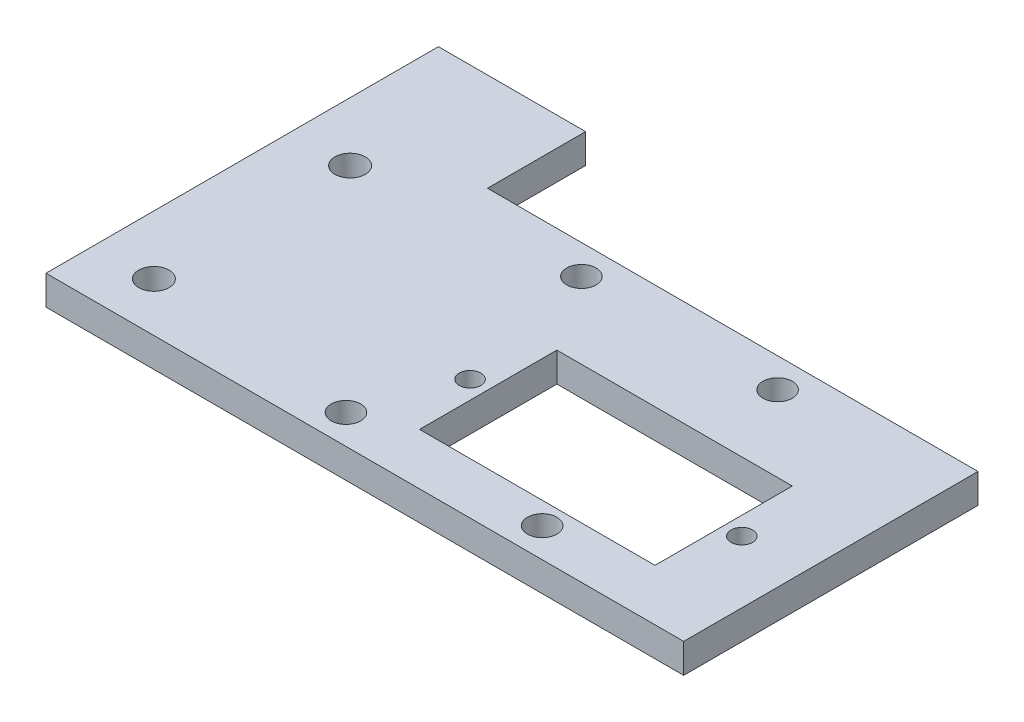
ISO-10303-21;
HEADER;
FILE_DESCRIPTION(('STEP AP214'),'2;1');
FILE_NAME('part.step','',(''),(''),'','','');
FILE_SCHEMA(('AUTOMOTIVE_DESIGN { 1 0 10303 214 1 1 1 1 }'));
ENDSEC;
DATA;
#1=APPLICATION_CONTEXT('core data for automotive mechanical design processes');
#2=APPLICATION_PROTOCOL_DEFINITION('international standard','automotive_design',2000,#1);
#3=PRODUCT_CONTEXT('',#1,'mechanical');
#4=PRODUCT('Part','Part','',(#3));
#5=PRODUCT_RELATED_PRODUCT_CATEGORY('part','',(#4));
#6=PRODUCT_DEFINITION_FORMATION('','',#4);
#7=PRODUCT_DEFINITION_CONTEXT('part definition',#1,'design');
#8=PRODUCT_DEFINITION('design','',#6,#7);
#9=PRODUCT_DEFINITION_SHAPE('','',#8);
#10=(LENGTH_UNIT() NAMED_UNIT(*) SI_UNIT(.MILLI.,.METRE.));
#11=(NAMED_UNIT(*) PLANE_ANGLE_UNIT() SI_UNIT($,.RADIAN.));
#12=(NAMED_UNIT(*) SI_UNIT($,.STERADIAN.) SOLID_ANGLE_UNIT());
#13=UNCERTAINTY_MEASURE_WITH_UNIT(LENGTH_MEASURE(1.E-05),#10,'distance_accuracy_value','');
#14=(GEOMETRIC_REPRESENTATION_CONTEXT(3) GLOBAL_UNCERTAINTY_ASSIGNED_CONTEXT((#13)) GLOBAL_UNIT_ASSIGNED_CONTEXT((#10,
#11,#12)) REPRESENTATION_CONTEXT('',''));
#15=CARTESIAN_POINT('',(0.,0.,0.));
#16=DIRECTION('',(0.,0.,1.));
#17=DIRECTION('',(1.,0.,0.));
#18=AXIS2_PLACEMENT_3D('',#15,#16,#17);
#19=CARTESIAN_POINT('',(32.5,3.,-20.));
#20=DIRECTION('',(-1.,0.,0.));
#21=DIRECTION('',(0.,0.,1.));
#22=AXIS2_PLACEMENT_3D('',#19,#20,#21);
#23=PLANE('',#22);
#24=DIRECTION('',(0.,0.,-1.));
#25=VECTOR('',#24,1.);
#26=CARTESIAN_POINT('',(32.5,0.,-20.));
#27=LINE('',#26,#25);
#28=CARTESIAN_POINT('',(32.5,0.,20.));
#29=VERTEX_POINT('',#28);
#30=CARTESIAN_POINT('',(32.5,0.,-9.99999999999998));
#31=VERTEX_POINT('',#30);
#32=EDGE_CURVE('E176',#29,#31,#27,.T.);
#33=ORIENTED_EDGE('',*,*,#32,.T.);
#34=DIRECTION('',(0.,-1.,0.));
#35=VECTOR('',#34,1.);
#36=CARTESIAN_POINT('',(32.5,10.,-9.99999999999998));
#37=LINE('',#36,#35);
#38=CARTESIAN_POINT('',(32.5,3.,-9.99999999999998));
#39=VERTEX_POINT('',#38);
#40=EDGE_CURVE('E153',#39,#31,#37,.T.);
#41=ORIENTED_EDGE('',*,*,#40,.F.);
#42=DIRECTION('',(0.,0.,-1.));
#43=VECTOR('',#42,1.);
#44=CARTESIAN_POINT('',(32.5,3.,-20.));
#45=LINE('',#44,#43);
#46=CARTESIAN_POINT('',(32.5,3.,20.));
#47=VERTEX_POINT('',#46);
#48=EDGE_CURVE('E177',#47,#39,#45,.T.);
#49=ORIENTED_EDGE('',*,*,#48,.F.);
#50=DIRECTION('',(0.,-1.,0.));
#51=VECTOR('',#50,1.);
#52=CARTESIAN_POINT('',(32.5,3.,20.));
#53=LINE('',#52,#51);
#54=EDGE_CURVE('E187',#47,#29,#53,.T.);
#55=ORIENTED_EDGE('',*,*,#54,.T.);
#56=EDGE_LOOP('',(#33,#41,#49,#55));
#57=FACE_BOUND('',#56,.T.);
#58=ADVANCED_FACE('F35',(#57),#23,.F.);
#59=CARTESIAN_POINT('',(-32.5,3.,-20.));
#60=DIRECTION('',(0.,0.,1.));
#61=DIRECTION('',(1.,0.,0.));
#62=AXIS2_PLACEMENT_3D('',#59,#60,#61);
#63=PLANE('',#62);
#64=DIRECTION('',(-1.,0.,0.));
#65=VECTOR('',#64,1.);
#66=CARTESIAN_POINT('',(-32.5,3.,-20.));
#67=LINE('',#66,#65);
#68=CARTESIAN_POINT('',(-17.5,3.,-20.));
#69=VERTEX_POINT('',#68);
#70=CARTESIAN_POINT('',(-32.5,3.,-20.));
#71=VERTEX_POINT('',#70);
#72=EDGE_CURVE('E180',#69,#71,#67,.T.);
#73=ORIENTED_EDGE('',*,*,#72,.F.);
#74=DIRECTION('',(0.,-1.,0.));
#75=VECTOR('',#74,1.);
#76=CARTESIAN_POINT('',(-17.5,10.,-20.));
#77=LINE('',#76,#75);
#78=CARTESIAN_POINT('',(-17.5,0.,-20.));
#79=VERTEX_POINT('',#78);
#80=EDGE_CURVE('E154',#69,#79,#77,.T.);
#81=ORIENTED_EDGE('',*,*,#80,.T.);
#82=DIRECTION('',(-1.,0.,0.));
#83=VECTOR('',#82,1.);
#84=CARTESIAN_POINT('',(-32.5,0.,-20.));
#85=LINE('',#84,#83);
#86=CARTESIAN_POINT('',(-32.5,0.,-20.));
#87=VERTEX_POINT('',#86);
#88=EDGE_CURVE('E190',#79,#87,#85,.T.);
#89=ORIENTED_EDGE('',*,*,#88,.T.);
#90=DIRECTION('',(0.,-1.,0.));
#91=VECTOR('',#90,1.);
#92=CARTESIAN_POINT('',(-32.5,3.,-20.));
#93=LINE('',#92,#91);
#94=EDGE_CURVE('E11',#71,#87,#93,.T.);
#95=ORIENTED_EDGE('',*,*,#94,.F.);
#96=EDGE_LOOP('',(#73,#81,#89,#95));
#97=FACE_BOUND('',#96,.T.);
#98=ADVANCED_FACE('F263',(#97),#63,.F.);
#99=CARTESIAN_POINT('',(-32.5,3.,-20.));
#100=DIRECTION('',(1.,0.,0.));
#101=DIRECTION('',(0.,0.,-1.));
#102=AXIS2_PLACEMENT_3D('',#99,#100,#101);
#103=PLANE('',#102);
#104=DIRECTION('',(0.,0.,1.));
#105=VECTOR('',#104,1.);
#106=CARTESIAN_POINT('',(-32.5,0.,-20.));
#107=LINE('',#106,#105);
#108=CARTESIAN_POINT('',(-32.5,0.,20.));
#109=VERTEX_POINT('',#108);
#110=EDGE_CURVE('E192',#87,#109,#107,.T.);
#111=ORIENTED_EDGE('',*,*,#110,.T.);
#112=DIRECTION('',(0.,-1.,0.));
#113=VECTOR('',#112,1.);
#114=CARTESIAN_POINT('',(-32.5,3.,20.));
#115=LINE('',#114,#113);
#116=CARTESIAN_POINT('',(-32.5,3.,20.));
#117=VERTEX_POINT('',#116);
#118=EDGE_CURVE('E43',#117,#109,#115,.T.);
#119=ORIENTED_EDGE('',*,*,#118,.F.);
#120=DIRECTION('',(0.,0.,1.));
#121=VECTOR('',#120,1.);
#122=CARTESIAN_POINT('',(-32.5,3.,-20.));
#123=LINE('',#122,#121);
#124=EDGE_CURVE('E183',#71,#117,#123,.T.);
#125=ORIENTED_EDGE('',*,*,#124,.F.);
#126=ORIENTED_EDGE('',*,*,#94,.T.);
#127=EDGE_LOOP('',(#111,#119,#125,#126));
#128=FACE_BOUND('',#127,.T.);
#129=ADVANCED_FACE('F268',(#128),#103,.F.);
#130=CARTESIAN_POINT('',(-32.5,3.,20.));
#131=DIRECTION('',(0.,0.,-1.));
#132=DIRECTION('',(-1.,0.,0.));
#133=AXIS2_PLACEMENT_3D('',#130,#131,#132);
#134=PLANE('',#133);
#135=DIRECTION('',(1.,0.,0.));
#136=VECTOR('',#135,1.);
#137=CARTESIAN_POINT('',(-32.5,0.,20.));
#138=LINE('',#137,#136);
#139=EDGE_CURVE('E181',#109,#29,#138,.T.);
#140=ORIENTED_EDGE('',*,*,#139,.T.);
#141=ORIENTED_EDGE('',*,*,#54,.F.);
#142=DIRECTION('',(1.,0.,0.));
#143=VECTOR('',#142,1.);
#144=CARTESIAN_POINT('',(-32.5,3.,20.));
#145=LINE('',#144,#143);
#146=EDGE_CURVE('E185',#117,#47,#145,.T.);
#147=ORIENTED_EDGE('',*,*,#146,.F.);
#148=ORIENTED_EDGE('',*,*,#118,.T.);
#149=EDGE_LOOP('',(#140,#141,#147,#148));
#150=FACE_BOUND('',#149,.T.);
#151=ADVANCED_FACE('F292',(#150),#134,.F.);
#152=CARTESIAN_POINT('',(0.,3.,0.));
#153=DIRECTION('',(0.,1.,0.));
#154=DIRECTION('',(0.,0.,1.));
#155=AXIS2_PLACEMENT_3D('',#152,#153,#154);
#156=PLANE('',#155);
#157=CARTESIAN_POINT('',(-4.92502499999987,3.,16.9999999999999));
#158=DIRECTION('',(0.,1.,0.));
#159=DIRECTION('',(0.,0.,1.));
#160=AXIS2_PLACEMENT_3D('',#157,#158,#159);
#161=CIRCLE('',#160,1.5);
#162=CARTESIAN_POINT('',(-4.92502499999987,3.,18.4999999999999));
#163=VERTEX_POINT('',#162);
#164=EDGE_CURVE('E210',#163,#163,#161,.T.);
#165=ORIENTED_EDGE('',*,*,#164,.F.);
#166=EDGE_LOOP('',(#165));
#167=FACE_BOUND('',#166,.T.);
#168=CARTESIAN_POINT('',(15.0749750000001,3.,-7.00000000000009));
#169=DIRECTION('',(0.,1.,0.));
#170=DIRECTION('',(0.,0.,1.));
#171=AXIS2_PLACEMENT_3D('',#168,#169,#170);
#172=CIRCLE('',#171,1.5);
#173=CARTESIAN_POINT('',(15.0749750000001,3.,-5.50000000000009));
#174=VERTEX_POINT('',#173);
#175=EDGE_CURVE('E215',#174,#174,#172,.T.);
#176=ORIENTED_EDGE('',*,*,#175,.F.);
#177=EDGE_LOOP('',(#176));
#178=FACE_BOUND('',#177,.T.);
#179=CARTESIAN_POINT('',(-4.9250249999999,3.,-7.00000000000008));
#180=DIRECTION('',(0.,1.,0.));
#181=DIRECTION('',(0.,0.,1.));
#182=AXIS2_PLACEMENT_3D('',#179,#180,#181);
#183=CIRCLE('',#182,1.5);
#184=CARTESIAN_POINT('',(-4.9250249999999,3.,-5.50000000000008));
#185=VERTEX_POINT('',#184);
#186=EDGE_CURVE('E218',#185,#185,#183,.T.);
#187=ORIENTED_EDGE('',*,*,#186,.F.);
#188=EDGE_LOOP('',(#187));
#189=FACE_BOUND('',#188,.T.);
#190=CARTESIAN_POINT('',(15.0749750000001,3.,16.9999999999999));
#191=DIRECTION('',(0.,1.,0.));
#192=DIRECTION('',(0.,0.,1.));
#193=AXIS2_PLACEMENT_3D('',#190,#191,#192);
#194=CIRCLE('',#193,1.5);
#195=CARTESIAN_POINT('',(15.0749750000001,3.,18.4999999999999));
#196=VERTEX_POINT('',#195);
#197=EDGE_CURVE('E221',#196,#196,#194,.T.);
#198=ORIENTED_EDGE('',*,*,#197,.F.);
#199=EDGE_LOOP('',(#198));
#200=FACE_BOUND('',#199,.T.);
#201=CARTESIAN_POINT('',(26.1749499999748,3.,7.7500000000004));
#202=DIRECTION('',(0.,1.,0.));
#203=DIRECTION('',(0.,0.,1.));
#204=AXIS2_PLACEMENT_3D('',#201,#202,#203);
#205=CIRCLE('',#204,1.10000000000004);
#206=CARTESIAN_POINT('',(26.1749499999748,3.,8.85000000000043));
#207=VERTEX_POINT('',#206);
#208=EDGE_CURVE('E200',#207,#207,#205,.T.);
#209=ORIENTED_EDGE('',*,*,#208,.F.);
#210=EDGE_LOOP('',(#209));
#211=FACE_BOUND('',#210,.T.);
#212=CARTESIAN_POINT('',(-1.52505000002522,3.,7.75000000000042));
#213=DIRECTION('',(0.,1.,0.));
#214=DIRECTION('',(0.,0.,1.));
#215=AXIS2_PLACEMENT_3D('',#212,#213,#214);
#216=CIRCLE('',#215,1.1);
#217=CARTESIAN_POINT('',(-1.52505000002522,3.,8.85000000000042));
#218=VERTEX_POINT('',#217);
#219=EDGE_CURVE('E205',#218,#218,#216,.T.);
#220=ORIENTED_EDGE('',*,*,#219,.F.);
#221=EDGE_LOOP('',(#220));
#222=FACE_BOUND('',#221,.T.);
#223=DIRECTION('',(0.,0.,1.));
#224=VECTOR('',#223,1.);
#225=CARTESIAN_POINT('',(0.324949999974778,3.,0.));
#226=LINE('',#225,#224);
#227=CARTESIAN_POINT('',(0.324949999974778,3.,0.750000000000394));
#228=VERTEX_POINT('',#227);
#229=CARTESIAN_POINT('',(0.324949999974778,3.,14.7500000000004));
#230=VERTEX_POINT('',#229);
#231=EDGE_CURVE('E146',#228,#230,#226,.T.);
#232=ORIENTED_EDGE('',*,*,#231,.F.);
#233=DIRECTION('',(-1.,0.,0.));
#234=VECTOR('',#233,1.);
#235=CARTESIAN_POINT('',(0.,3.,0.750000000000394));
#236=LINE('',#235,#234);
#237=CARTESIAN_POINT('',(24.3249499999748,3.,0.750000000000394));
#238=VERTEX_POINT('',#237);
#239=EDGE_CURVE('E139',#238,#228,#236,.T.);
#240=ORIENTED_EDGE('',*,*,#239,.F.);
#241=DIRECTION('',(0.,0.,-1.));
#242=VECTOR('',#241,1.);
#243=CARTESIAN_POINT('',(24.3249499999748,3.,0.));
#244=LINE('',#243,#242);
#245=CARTESIAN_POINT('',(24.3249499999748,3.,14.7500000000004));
#246=VERTEX_POINT('',#245);
#247=EDGE_CURVE('E119',#246,#238,#244,.T.);
#248=ORIENTED_EDGE('',*,*,#247,.F.);
#249=DIRECTION('',(1.,0.,0.));
#250=VECTOR('',#249,1.);
#251=CARTESIAN_POINT('',(0.,3.,14.7500000000004));
#252=LINE('',#251,#250);
#253=EDGE_CURVE('E144',#230,#246,#252,.T.);
#254=ORIENTED_EDGE('',*,*,#253,.F.);
#255=EDGE_LOOP('',(#232,#240,#248,#254));
#256=FACE_BOUND('',#255,.T.);
#257=DIRECTION('',(0.,0.,1.));
#258=VECTOR('',#257,1.);
#259=CARTESIAN_POINT('',(-17.5,3.,0.));
#260=LINE('',#259,#258);
#261=CARTESIAN_POINT('',(-17.5,3.,-9.99999999999998));
#262=VERTEX_POINT('',#261);
#263=EDGE_CURVE('E162',#69,#262,#260,.T.);
#264=ORIENTED_EDGE('',*,*,#263,.F.);
#265=ORIENTED_EDGE('',*,*,#72,.T.);
#266=ORIENTED_EDGE('',*,*,#124,.T.);
#267=ORIENTED_EDGE('',*,*,#146,.T.);
#268=ORIENTED_EDGE('',*,*,#48,.T.);
#269=DIRECTION('',(1.,0.,0.));
#270=VECTOR('',#269,1.);
#271=CARTESIAN_POINT('',(0.,3.,-9.99999999999998));
#272=LINE('',#271,#270);
#273=EDGE_CURVE('E157',#262,#39,#272,.T.);
#274=ORIENTED_EDGE('',*,*,#273,.F.);
#275=EDGE_LOOP('',(#264,#265,#266,#267,#268,#274));
#276=FACE_BOUND('',#275,.T.);
#277=CARTESIAN_POINT('',(-26.5,3.,15.));
#278=DIRECTION('',(0.,1.,0.));
#279=DIRECTION('',(0.,0.,1.));
#280=AXIS2_PLACEMENT_3D('',#277,#278,#279);
#281=CIRCLE('',#280,1.55);
#282=CARTESIAN_POINT('',(-26.5,3.,16.55));
#283=VERTEX_POINT('',#282);
#284=EDGE_CURVE('E173',#283,#283,#281,.T.);
#285=ORIENTED_EDGE('',*,*,#284,.F.);
#286=EDGE_LOOP('',(#285));
#287=FACE_BOUND('',#286,.T.);
#288=CARTESIAN_POINT('',(-26.5,3.,-5.00000000000002));
#289=DIRECTION('',(0.,1.,0.));
#290=DIRECTION('',(0.,0.,1.));
#291=AXIS2_PLACEMENT_3D('',#288,#289,#290);
#292=CIRCLE('',#291,1.55);
#293=CARTESIAN_POINT('',(-26.5,3.,-3.45000000000002));
#294=VERTEX_POINT('',#293);
#295=EDGE_CURVE('E168',#294,#294,#292,.T.);
#296=ORIENTED_EDGE('',*,*,#295,.F.);
#297=EDGE_LOOP('',(#296));
#298=FACE_BOUND('',#297,.T.);
#299=ADVANCED_FACE('F242',(#167,#178,#189,#200,#211,#222,#256,#276,#287,#298),#156,.T.);
#300=CARTESIAN_POINT('',(0.,0.,0.));
#301=DIRECTION('',(0.,1.,0.));
#302=DIRECTION('',(0.,0.,1.));
#303=AXIS2_PLACEMENT_3D('',#300,#301,#302);
#304=PLANE('',#303);
#305=CARTESIAN_POINT('',(-4.92502499999987,0.,16.9999999999999));
#306=DIRECTION('',(0.,-1.,0.));
#307=DIRECTION('',(0.,0.,-1.));
#308=AXIS2_PLACEMENT_3D('',#305,#306,#307);
#309=CIRCLE('',#308,1.5);
#310=CARTESIAN_POINT('',(-4.92502499999987,0.,15.4999999999999));
#311=VERTEX_POINT('',#310);
#312=EDGE_CURVE('E227',#311,#311,#309,.T.);
#313=ORIENTED_EDGE('',*,*,#312,.F.);
#314=EDGE_LOOP('',(#313));
#315=FACE_BOUND('',#314,.T.);
#316=CARTESIAN_POINT('',(15.0749750000001,0.,-7.00000000000009));
#317=DIRECTION('',(0.,-1.,0.));
#318=DIRECTION('',(0.,0.,-1.));
#319=AXIS2_PLACEMENT_3D('',#316,#317,#318);
#320=CIRCLE('',#319,1.5);
#321=CARTESIAN_POINT('',(15.0749750000001,0.,-8.5000000000001));
#322=VERTEX_POINT('',#321);
#323=EDGE_CURVE('E228',#322,#322,#320,.T.);
#324=ORIENTED_EDGE('',*,*,#323,.F.);
#325=EDGE_LOOP('',(#324));
#326=FACE_BOUND('',#325,.T.);
#327=CARTESIAN_POINT('',(-4.9250249999999,0.,-7.00000000000008));
#328=DIRECTION('',(0.,-1.,0.));
#329=DIRECTION('',(0.,0.,-1.));
#330=AXIS2_PLACEMENT_3D('',#327,#328,#329);
#331=CIRCLE('',#330,1.5);
#332=CARTESIAN_POINT('',(-4.9250249999999,0.,-8.50000000000008));
#333=VERTEX_POINT('',#332);
#334=EDGE_CURVE('E231',#333,#333,#331,.T.);
#335=ORIENTED_EDGE('',*,*,#334,.F.);
#336=EDGE_LOOP('',(#335));
#337=FACE_BOUND('',#336,.T.);
#338=CARTESIAN_POINT('',(15.0749750000001,0.,16.9999999999999));
#339=DIRECTION('',(0.,-1.,0.));
#340=DIRECTION('',(0.,0.,-1.));
#341=AXIS2_PLACEMENT_3D('',#338,#339,#340);
#342=CIRCLE('',#341,1.5);
#343=CARTESIAN_POINT('',(15.0749750000001,0.,15.4999999999999));
#344=VERTEX_POINT('',#343);
#345=EDGE_CURVE('E224',#344,#344,#342,.T.);
#346=ORIENTED_EDGE('',*,*,#345,.F.);
#347=EDGE_LOOP('',(#346));
#348=FACE_BOUND('',#347,.T.);
#349=CARTESIAN_POINT('',(26.1749499999748,0.,7.7500000000004));
#350=DIRECTION('',(0.,1.,0.));
#351=DIRECTION('',(0.,0.,1.));
#352=AXIS2_PLACEMENT_3D('',#349,#350,#351);
#353=CIRCLE('',#352,1.10000000000004);
#354=CARTESIAN_POINT('',(26.1749499999748,0.,8.85000000000043));
#355=VERTEX_POINT('',#354);
#356=EDGE_CURVE('E38',#355,#355,#353,.T.);
#357=ORIENTED_EDGE('',*,*,#356,.T.);
#358=EDGE_LOOP('',(#357));
#359=FACE_BOUND('',#358,.T.);
#360=CARTESIAN_POINT('',(-1.52505000002522,0.,7.75000000000042));
#361=DIRECTION('',(0.,1.,0.));
#362=DIRECTION('',(0.,0.,1.));
#363=AXIS2_PLACEMENT_3D('',#360,#361,#362);
#364=CIRCLE('',#363,1.1);
#365=CARTESIAN_POINT('',(-1.52505000002522,0.,8.85000000000042));
#366=VERTEX_POINT('',#365);
#367=EDGE_CURVE('E198',#366,#366,#364,.T.);
#368=ORIENTED_EDGE('',*,*,#367,.T.);
#369=EDGE_LOOP('',(#368));
#370=FACE_BOUND('',#369,.T.);
#371=DIRECTION('',(1.,0.,0.));
#372=VECTOR('',#371,1.);
#373=CARTESIAN_POINT('',(24.3249499999748,0.,0.750000000000394));
#374=LINE('',#373,#372);
#375=CARTESIAN_POINT('',(0.324949999974778,0.,0.750000000000394));
#376=VERTEX_POINT('',#375);
#377=CARTESIAN_POINT('',(24.3249499999748,0.,0.750000000000394));
#378=VERTEX_POINT('',#377);
#379=EDGE_CURVE('E125',#376,#378,#374,.T.);
#380=ORIENTED_EDGE('',*,*,#379,.F.);
#381=DIRECTION('',(0.,0.,-1.));
#382=VECTOR('',#381,1.);
#383=CARTESIAN_POINT('',(0.324949999974778,0.,0.750000000000394));
#384=LINE('',#383,#382);
#385=CARTESIAN_POINT('',(0.324949999974778,0.,14.7500000000004));
#386=VERTEX_POINT('',#385);
#387=EDGE_CURVE('E59',#386,#376,#384,.T.);
#388=ORIENTED_EDGE('',*,*,#387,.F.);
#389=DIRECTION('',(-1.,0.,0.));
#390=VECTOR('',#389,1.);
#391=CARTESIAN_POINT('',(24.3249499999748,0.,14.7500000000004));
#392=LINE('',#391,#390);
#393=CARTESIAN_POINT('',(24.3249499999748,0.,14.7500000000004));
#394=VERTEX_POINT('',#393);
#395=EDGE_CURVE('E132',#394,#386,#392,.T.);
#396=ORIENTED_EDGE('',*,*,#395,.F.);
#397=DIRECTION('',(0.,0.,1.));
#398=VECTOR('',#397,1.);
#399=CARTESIAN_POINT('',(24.3249499999748,0.,0.750000000000394));
#400=LINE('',#399,#398);
#401=EDGE_CURVE('E116',#378,#394,#400,.T.);
#402=ORIENTED_EDGE('',*,*,#401,.F.);
#403=EDGE_LOOP('',(#380,#388,#396,#402));
#404=FACE_BOUND('',#403,.T.);
#405=CARTESIAN_POINT('',(-26.5,0.,15.));
#406=DIRECTION('',(0.,-1.,0.));
#407=DIRECTION('',(0.,0.,-1.));
#408=AXIS2_PLACEMENT_3D('',#405,#406,#407);
#409=CIRCLE('',#408,1.55);
#410=CARTESIAN_POINT('',(-26.5,0.,13.45));
#411=VERTEX_POINT('',#410);
#412=EDGE_CURVE('E165',#411,#411,#409,.T.);
#413=ORIENTED_EDGE('',*,*,#412,.F.);
#414=EDGE_LOOP('',(#413));
#415=FACE_BOUND('',#414,.T.);
#416=CARTESIAN_POINT('',(-26.5,0.,-5.00000000000002));
#417=DIRECTION('',(0.,-1.,0.));
#418=DIRECTION('',(0.,0.,-1.));
#419=AXIS2_PLACEMENT_3D('',#416,#417,#418);
#420=CIRCLE('',#419,1.55);
#421=CARTESIAN_POINT('',(-26.5,0.,-6.55000000000002));
#422=VERTEX_POINT('',#421);
#423=EDGE_CURVE('E164',#422,#422,#420,.T.);
#424=ORIENTED_EDGE('',*,*,#423,.F.);
#425=EDGE_LOOP('',(#424));
#426=FACE_BOUND('',#425,.T.);
#427=ORIENTED_EDGE('',*,*,#88,.F.);
#428=DIRECTION('',(0.,0.,-1.));
#429=VECTOR('',#428,1.);
#430=CARTESIAN_POINT('',(-17.5,0.,-20.));
#431=LINE('',#430,#429);
#432=CARTESIAN_POINT('',(-17.5,0.,-9.99999999999998));
#433=VERTEX_POINT('',#432);
#434=EDGE_CURVE('E151',#433,#79,#431,.T.);
#435=ORIENTED_EDGE('',*,*,#434,.F.);
#436=DIRECTION('',(-1.,0.,0.));
#437=VECTOR('',#436,1.);
#438=CARTESIAN_POINT('',(32.5,0.,-9.99999999999998));
#439=LINE('',#438,#437);
#440=EDGE_CURVE('E148',#31,#433,#439,.T.);
#441=ORIENTED_EDGE('',*,*,#440,.F.);
#442=ORIENTED_EDGE('',*,*,#32,.F.);
#443=ORIENTED_EDGE('',*,*,#139,.F.);
#444=ORIENTED_EDGE('',*,*,#110,.F.);
#445=EDGE_LOOP('',(#427,#435,#441,#442,#443,#444));
#446=FACE_BOUND('',#445,.T.);
#447=ADVANCED_FACE('F129',(#315,#326,#337,#348,#359,#370,#404,#415,#426,#446),#304,.F.);
#448=CARTESIAN_POINT('',(-26.5,10.,-5.00000000000002));
#449=DIRECTION('',(0.,-1.,0.));
#450=DIRECTION('',(0.,0.,-1.));
#451=AXIS2_PLACEMENT_3D('',#448,#449,#450);
#452=CYLINDRICAL_SURFACE('',#451,1.55);
#453=ORIENTED_EDGE('',*,*,#295,.T.);
#454=EDGE_LOOP('',(#453));
#455=FACE_BOUND('',#454,.T.);
#456=ORIENTED_EDGE('',*,*,#423,.T.);
#457=EDGE_LOOP('',(#456));
#458=FACE_BOUND('',#457,.T.);
#459=ADVANCED_FACE('F241',(#455,#458),#452,.F.);
#460=CARTESIAN_POINT('',(-26.5,10.,15.));
#461=DIRECTION('',(0.,-1.,0.));
#462=DIRECTION('',(0.,0.,-1.));
#463=AXIS2_PLACEMENT_3D('',#460,#461,#462);
#464=CYLINDRICAL_SURFACE('',#463,1.55);
#465=ORIENTED_EDGE('',*,*,#284,.T.);
#466=EDGE_LOOP('',(#465));
#467=FACE_BOUND('',#466,.T.);
#468=ORIENTED_EDGE('',*,*,#412,.T.);
#469=EDGE_LOOP('',(#468));
#470=FACE_BOUND('',#469,.T.);
#471=ADVANCED_FACE('F298',(#467,#470),#464,.F.);
#472=CARTESIAN_POINT('',(-17.5,10.,-20.));
#473=DIRECTION('',(-1.,0.,0.));
#474=DIRECTION('',(0.,0.,1.));
#475=AXIS2_PLACEMENT_3D('',#472,#473,#474);
#476=PLANE('',#475);
#477=ORIENTED_EDGE('',*,*,#263,.T.);
#478=DIRECTION('',(0.,-1.,0.));
#479=VECTOR('',#478,1.);
#480=CARTESIAN_POINT('',(-17.5,10.,-9.99999999999998));
#481=LINE('',#480,#479);
#482=EDGE_CURVE('E158',#262,#433,#481,.T.);
#483=ORIENTED_EDGE('',*,*,#482,.T.);
#484=ORIENTED_EDGE('',*,*,#434,.T.);
#485=ORIENTED_EDGE('',*,*,#80,.F.);
#486=EDGE_LOOP('',(#477,#483,#484,#485));
#487=FACE_BOUND('',#486,.T.);
#488=ADVANCED_FACE('F296',(#487),#476,.F.);
#489=CARTESIAN_POINT('',(32.5,10.,-9.99999999999998));
#490=DIRECTION('',(0.,0.,1.));
#491=DIRECTION('',(1.,0.,0.));
#492=AXIS2_PLACEMENT_3D('',#489,#490,#491);
#493=PLANE('',#492);
#494=ORIENTED_EDGE('',*,*,#273,.T.);
#495=ORIENTED_EDGE('',*,*,#40,.T.);
#496=ORIENTED_EDGE('',*,*,#440,.T.);
#497=ORIENTED_EDGE('',*,*,#482,.F.);
#498=EDGE_LOOP('',(#494,#495,#496,#497));
#499=FACE_BOUND('',#498,.T.);
#500=ADVANCED_FACE('F282',(#499),#493,.F.);
#501=CARTESIAN_POINT('',(0.324949999974778,10.,0.750000000000394));
#502=DIRECTION('',(-1.,0.,0.));
#503=DIRECTION('',(0.,0.,1.));
#504=AXIS2_PLACEMENT_3D('',#501,#502,#503);
#505=PLANE('',#504);
#506=ORIENTED_EDGE('',*,*,#231,.T.);
#507=DIRECTION('',(0.,-1.,0.));
#508=VECTOR('',#507,1.);
#509=CARTESIAN_POINT('',(0.324949999974778,10.,14.7500000000004));
#510=LINE('',#509,#508);
#511=EDGE_CURVE('E137',#230,#386,#510,.T.);
#512=ORIENTED_EDGE('',*,*,#511,.T.);
#513=ORIENTED_EDGE('',*,*,#387,.T.);
#514=DIRECTION('',(0.,-1.,0.));
#515=VECTOR('',#514,1.);
#516=CARTESIAN_POINT('',(0.324949999974778,10.,0.750000000000394));
#517=LINE('',#516,#515);
#518=EDGE_CURVE('E122',#228,#376,#517,.T.);
#519=ORIENTED_EDGE('',*,*,#518,.F.);
#520=EDGE_LOOP('',(#506,#512,#513,#519));
#521=FACE_BOUND('',#520,.T.);
#522=ADVANCED_FACE('F304',(#521),#505,.F.);
#523=CARTESIAN_POINT('',(24.3249499999748,10.,14.7500000000004));
#524=DIRECTION('',(0.,0.,1.));
#525=DIRECTION('',(1.,0.,0.));
#526=AXIS2_PLACEMENT_3D('',#523,#524,#525);
#527=PLANE('',#526);
#528=ORIENTED_EDGE('',*,*,#253,.T.);
#529=DIRECTION('',(0.,-1.,0.));
#530=VECTOR('',#529,1.);
#531=CARTESIAN_POINT('',(24.3249499999748,10.,14.7500000000004));
#532=LINE('',#531,#530);
#533=EDGE_CURVE('E121',#246,#394,#532,.T.);
#534=ORIENTED_EDGE('',*,*,#533,.T.);
#535=ORIENTED_EDGE('',*,*,#395,.T.);
#536=ORIENTED_EDGE('',*,*,#511,.F.);
#537=EDGE_LOOP('',(#528,#534,#535,#536));
#538=FACE_BOUND('',#537,.T.);
#539=ADVANCED_FACE('F372',(#538),#527,.F.);
#540=CARTESIAN_POINT('',(24.3249499999748,10.,0.750000000000394));
#541=DIRECTION('',(1.,0.,0.));
#542=DIRECTION('',(0.,0.,-1.));
#543=AXIS2_PLACEMENT_3D('',#540,#541,#542);
#544=PLANE('',#543);
#545=ORIENTED_EDGE('',*,*,#247,.T.);
#546=DIRECTION('',(0.,-1.,0.));
#547=VECTOR('',#546,1.);
#548=CARTESIAN_POINT('',(24.3249499999748,10.,0.750000000000394));
#549=LINE('',#548,#547);
#550=EDGE_CURVE('E51',#238,#378,#549,.T.);
#551=ORIENTED_EDGE('',*,*,#550,.T.);
#552=ORIENTED_EDGE('',*,*,#401,.T.);
#553=ORIENTED_EDGE('',*,*,#533,.F.);
#554=EDGE_LOOP('',(#545,#551,#552,#553));
#555=FACE_BOUND('',#554,.T.);
#556=ADVANCED_FACE('F113',(#555),#544,.F.);
#557=CARTESIAN_POINT('',(24.3249499999748,10.,0.750000000000394));
#558=DIRECTION('',(0.,0.,-1.));
#559=DIRECTION('',(-1.,0.,0.));
#560=AXIS2_PLACEMENT_3D('',#557,#558,#559);
#561=PLANE('',#560);
#562=ORIENTED_EDGE('',*,*,#239,.T.);
#563=ORIENTED_EDGE('',*,*,#518,.T.);
#564=ORIENTED_EDGE('',*,*,#379,.T.);
#565=ORIENTED_EDGE('',*,*,#550,.F.);
#566=EDGE_LOOP('',(#562,#563,#564,#565));
#567=FACE_BOUND('',#566,.T.);
#568=ADVANCED_FACE('F126',(#567),#561,.F.);
#569=CARTESIAN_POINT('',(-1.52505000002522,-7.,7.75000000000042));
#570=DIRECTION('',(0.,1.,0.));
#571=DIRECTION('',(0.,0.,1.));
#572=AXIS2_PLACEMENT_3D('',#569,#570,#571);
#573=CYLINDRICAL_SURFACE('',#572,1.1);
#574=ORIENTED_EDGE('',*,*,#219,.T.);
#575=EDGE_LOOP('',(#574));
#576=FACE_BOUND('',#575,.T.);
#577=ORIENTED_EDGE('',*,*,#367,.F.);
#578=EDGE_LOOP('',(#577));
#579=FACE_BOUND('',#578,.T.);
#580=ADVANCED_FACE('F252',(#576,#579),#573,.F.);
#581=CARTESIAN_POINT('',(26.1749499999748,-7.,7.7500000000004));
#582=DIRECTION('',(0.,1.,0.));
#583=DIRECTION('',(0.,0.,1.));
#584=AXIS2_PLACEMENT_3D('',#581,#582,#583);
#585=CYLINDRICAL_SURFACE('',#584,1.10000000000004);
#586=ORIENTED_EDGE('',*,*,#208,.T.);
#587=EDGE_LOOP('',(#586));
#588=FACE_BOUND('',#587,.T.);
#589=ORIENTED_EDGE('',*,*,#356,.F.);
#590=EDGE_LOOP('',(#589));
#591=FACE_BOUND('',#590,.T.);
#592=ADVANCED_FACE('F249',(#588,#591),#585,.F.);
#593=CARTESIAN_POINT('',(15.0749750000001,25.,16.9999999999999));
#594=DIRECTION('',(0.,-1.,0.));
#595=DIRECTION('',(0.,0.,-1.));
#596=AXIS2_PLACEMENT_3D('',#593,#594,#595);
#597=CYLINDRICAL_SURFACE('',#596,1.5);
#598=ORIENTED_EDGE('',*,*,#197,.T.);
#599=EDGE_LOOP('',(#598));
#600=FACE_BOUND('',#599,.T.);
#601=ORIENTED_EDGE('',*,*,#345,.T.);
#602=EDGE_LOOP('',(#601));
#603=FACE_BOUND('',#602,.T.);
#604=ADVANCED_FACE('F251',(#600,#603),#597,.F.);
#605=CARTESIAN_POINT('',(-4.9250249999999,25.,-7.00000000000008));
#606=DIRECTION('',(0.,-1.,0.));
#607=DIRECTION('',(0.,0.,-1.));
#608=AXIS2_PLACEMENT_3D('',#605,#606,#607);
#609=CYLINDRICAL_SURFACE('',#608,1.5);
#610=ORIENTED_EDGE('',*,*,#186,.T.);
#611=EDGE_LOOP('',(#610));
#612=FACE_BOUND('',#611,.T.);
#613=ORIENTED_EDGE('',*,*,#334,.T.);
#614=EDGE_LOOP('',(#613));
#615=FACE_BOUND('',#614,.T.);
#616=ADVANCED_FACE('F237',(#612,#615),#609,.F.);
#617=CARTESIAN_POINT('',(15.0749750000001,25.,-7.00000000000009));
#618=DIRECTION('',(0.,-1.,0.));
#619=DIRECTION('',(0.,0.,-1.));
#620=AXIS2_PLACEMENT_3D('',#617,#618,#619);
#621=CYLINDRICAL_SURFACE('',#620,1.5);
#622=ORIENTED_EDGE('',*,*,#175,.T.);
#623=EDGE_LOOP('',(#622));
#624=FACE_BOUND('',#623,.T.);
#625=ORIENTED_EDGE('',*,*,#323,.T.);
#626=EDGE_LOOP('',(#625));
#627=FACE_BOUND('',#626,.T.);
#628=ADVANCED_FACE('F419',(#624,#627),#621,.F.);
#629=CARTESIAN_POINT('',(-4.92502499999987,25.,16.9999999999999));
#630=DIRECTION('',(0.,-1.,0.));
#631=DIRECTION('',(0.,0.,-1.));
#632=AXIS2_PLACEMENT_3D('',#629,#630,#631);
#633=CYLINDRICAL_SURFACE('',#632,1.5);
#634=ORIENTED_EDGE('',*,*,#164,.T.);
#635=EDGE_LOOP('',(#634));
#636=FACE_BOUND('',#635,.T.);
#637=ORIENTED_EDGE('',*,*,#312,.T.);
#638=EDGE_LOOP('',(#637));
#639=FACE_BOUND('',#638,.T.);
#640=ADVANCED_FACE('F428',(#636,#639),#633,.F.);
#641=CLOSED_SHELL('',(#58,#98,#129,#151,#299,#447,#459,#471,#488,#500,#522,#539,#556,#568,#580,
#592,#604,#616,#628,#640));
#642=MANIFOLD_SOLID_BREP('B2',#641);
#643=ADVANCED_BREP_SHAPE_REPRESENTATION('',(#18,#642),#14);
#644=SHAPE_DEFINITION_REPRESENTATION(#9,#643);
ENDSEC;
END-ISO-10303-21;
